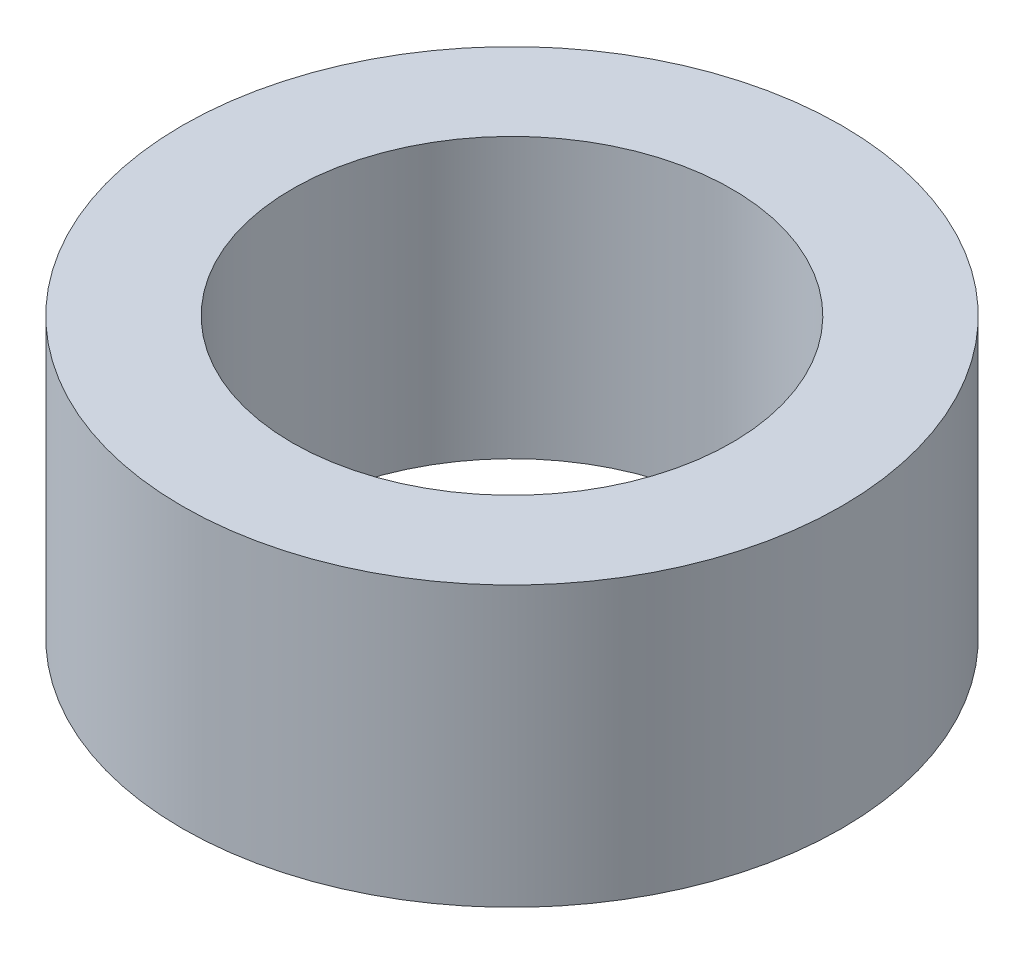
ISO-10303-21;
HEADER;
FILE_DESCRIPTION(('STEP AP214'),'2;1');
FILE_NAME('part.step','',(''),(''),'','','');
FILE_SCHEMA(('AUTOMOTIVE_DESIGN { 1 0 10303 214 1 1 1 1 }'));
ENDSEC;
DATA;
#1=APPLICATION_CONTEXT('core data for automotive mechanical design processes');
#2=APPLICATION_PROTOCOL_DEFINITION('international standard','automotive_design',2000,#1);
#3=PRODUCT_CONTEXT('',#1,'mechanical');
#4=PRODUCT('Part','Part','',(#3));
#5=PRODUCT_RELATED_PRODUCT_CATEGORY('part','',(#4));
#6=PRODUCT_DEFINITION_FORMATION('','',#4);
#7=PRODUCT_DEFINITION_CONTEXT('part definition',#1,'design');
#8=PRODUCT_DEFINITION('design','',#6,#7);
#9=PRODUCT_DEFINITION_SHAPE('','',#8);
#10=(LENGTH_UNIT() NAMED_UNIT(*) SI_UNIT(.MILLI.,.METRE.));
#11=(NAMED_UNIT(*) PLANE_ANGLE_UNIT() SI_UNIT($,.RADIAN.));
#12=(NAMED_UNIT(*) SI_UNIT($,.STERADIAN.) SOLID_ANGLE_UNIT());
#13=UNCERTAINTY_MEASURE_WITH_UNIT(LENGTH_MEASURE(1.E-05),#10,'distance_accuracy_value','');
#14=(GEOMETRIC_REPRESENTATION_CONTEXT(3) GLOBAL_UNCERTAINTY_ASSIGNED_CONTEXT((#13)) GLOBAL_UNIT_ASSIGNED_CONTEXT((#10,
#11,#12)) REPRESENTATION_CONTEXT('',''));
#15=CARTESIAN_POINT('',(0.,0.,0.));
#16=DIRECTION('',(0.,0.,1.));
#17=DIRECTION('',(1.,0.,0.));
#18=AXIS2_PLACEMENT_3D('',#15,#16,#17);
#19=CARTESIAN_POINT('',(0.,12.7,0.));
#20=DIRECTION('',(0.,1.,0.));
#21=DIRECTION('',(0.,0.,1.));
#22=AXIS2_PLACEMENT_3D('',#19,#20,#21);
#23=PLANE('',#22);
#24=CARTESIAN_POINT('',(0.,12.7,0.));
#25=DIRECTION('',(0.,1.,0.));
#26=DIRECTION('',(0.,0.,1.));
#27=AXIS2_PLACEMENT_3D('',#24,#25,#26);
#28=CIRCLE('',#27,15.);
#29=CARTESIAN_POINT('',(0.,12.7,15.));
#30=VERTEX_POINT('',#29);
#31=EDGE_CURVE('E10',#30,#30,#28,.T.);
#32=ORIENTED_EDGE('',*,*,#31,.T.);
#33=EDGE_LOOP('',(#32));
#34=FACE_BOUND('',#33,.T.);
#35=CARTESIAN_POINT('',(0.,12.7,0.));
#36=DIRECTION('',(0.,1.,0.));
#37=DIRECTION('',(0.,0.,1.));
#38=AXIS2_PLACEMENT_3D('',#35,#36,#37);
#39=CIRCLE('',#38,10.);
#40=CARTESIAN_POINT('',(0.,12.7,10.));
#41=VERTEX_POINT('',#40);
#42=EDGE_CURVE('E43',#41,#41,#39,.T.);
#43=ORIENTED_EDGE('',*,*,#42,.F.);
#44=EDGE_LOOP('',(#43));
#45=FACE_BOUND('',#44,.T.);
#46=ADVANCED_FACE('F32',(#34,#45),#23,.T.);
#47=CARTESIAN_POINT('',(0.,0.,0.));
#48=DIRECTION('',(0.,1.,0.));
#49=DIRECTION('',(0.,0.,1.));
#50=AXIS2_PLACEMENT_3D('',#47,#48,#49);
#51=PLANE('',#50);
#52=CARTESIAN_POINT('',(0.,0.,0.));
#53=DIRECTION('',(0.,1.,0.));
#54=DIRECTION('',(0.,0.,1.));
#55=AXIS2_PLACEMENT_3D('',#52,#53,#54);
#56=CIRCLE('',#55,15.);
#57=CARTESIAN_POINT('',(0.,0.,15.));
#58=VERTEX_POINT('',#57);
#59=EDGE_CURVE('E36',#58,#58,#56,.T.);
#60=ORIENTED_EDGE('',*,*,#59,.F.);
#61=EDGE_LOOP('',(#60));
#62=FACE_BOUND('',#61,.T.);
#63=CARTESIAN_POINT('',(0.,0.,0.));
#64=DIRECTION('',(0.,1.,0.));
#65=DIRECTION('',(0.,0.,1.));
#66=AXIS2_PLACEMENT_3D('',#63,#64,#65);
#67=CIRCLE('',#66,10.);
#68=CARTESIAN_POINT('',(0.,0.,10.));
#69=VERTEX_POINT('',#68);
#70=EDGE_CURVE('E45',#69,#69,#67,.T.);
#71=ORIENTED_EDGE('',*,*,#70,.T.);
#72=EDGE_LOOP('',(#71));
#73=FACE_BOUND('',#72,.T.);
#74=ADVANCED_FACE('F55',(#62,#73),#51,.F.);
#75=CARTESIAN_POINT('',(0.,12.7,0.));
#76=DIRECTION('',(0.,-1.,0.));
#77=DIRECTION('',(0.,0.,-1.));
#78=AXIS2_PLACEMENT_3D('',#75,#76,#77);
#79=CYLINDRICAL_SURFACE('',#78,15.);
#80=ORIENTED_EDGE('',*,*,#31,.F.);
#81=EDGE_LOOP('',(#80));
#82=FACE_BOUND('',#81,.T.);
#83=ORIENTED_EDGE('',*,*,#59,.T.);
#84=EDGE_LOOP('',(#83));
#85=FACE_BOUND('',#84,.T.);
#86=ADVANCED_FACE('F34',(#82,#85),#79,.T.);
#87=CARTESIAN_POINT('',(0.,12.7,0.));
#88=DIRECTION('',(0.,-1.,0.));
#89=DIRECTION('',(0.,0.,-1.));
#90=AXIS2_PLACEMENT_3D('',#87,#88,#89);
#91=CYLINDRICAL_SURFACE('',#90,10.);
#92=ORIENTED_EDGE('',*,*,#42,.T.);
#93=EDGE_LOOP('',(#92));
#94=FACE_BOUND('',#93,.T.);
#95=ORIENTED_EDGE('',*,*,#70,.F.);
#96=EDGE_LOOP('',(#95));
#97=FACE_BOUND('',#96,.T.);
#98=ADVANCED_FACE('F51',(#94,#97),#91,.F.);
#99=CLOSED_SHELL('',(#46,#74,#86,#98));
#100=MANIFOLD_SOLID_BREP('B2',#99);
#101=ADVANCED_BREP_SHAPE_REPRESENTATION('',(#18,#100),#14);
#102=SHAPE_DEFINITION_REPRESENTATION(#9,#101);
ENDSEC;
END-ISO-10303-21;
